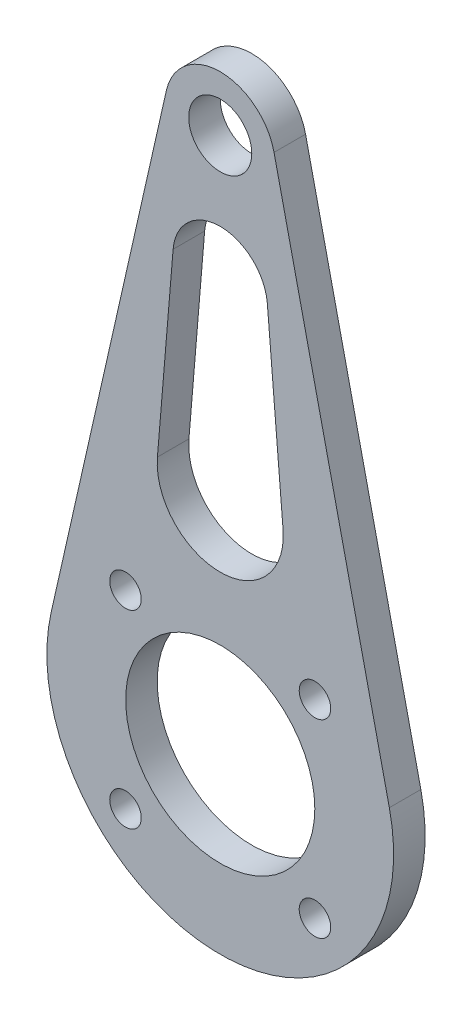
ISO-10303-21;
HEADER;
FILE_DESCRIPTION(('STEP AP214'),'2;1');
FILE_NAME('part.step','',(''),(''),'','','');
FILE_SCHEMA(('AUTOMOTIVE_DESIGN { 1 0 10303 214 1 1 1 1 }'));
ENDSEC;
DATA;
#1=APPLICATION_CONTEXT('core data for automotive mechanical design processes');
#2=APPLICATION_PROTOCOL_DEFINITION('international standard','automotive_design',2000,#1);
#3=PRODUCT_CONTEXT('',#1,'mechanical');
#4=PRODUCT('Part','Part','',(#3));
#5=PRODUCT_RELATED_PRODUCT_CATEGORY('part','',(#4));
#6=PRODUCT_DEFINITION_FORMATION('','',#4);
#7=PRODUCT_DEFINITION_CONTEXT('part definition',#1,'design');
#8=PRODUCT_DEFINITION('design','',#6,#7);
#9=PRODUCT_DEFINITION_SHAPE('','',#8);
#10=(LENGTH_UNIT() NAMED_UNIT(*) SI_UNIT(.MILLI.,.METRE.));
#11=(NAMED_UNIT(*) PLANE_ANGLE_UNIT() SI_UNIT($,.RADIAN.));
#12=(NAMED_UNIT(*) SI_UNIT($,.STERADIAN.) SOLID_ANGLE_UNIT());
#13=UNCERTAINTY_MEASURE_WITH_UNIT(LENGTH_MEASURE(1.E-05),#10,'distance_accuracy_value','');
#14=(GEOMETRIC_REPRESENTATION_CONTEXT(3) GLOBAL_UNCERTAINTY_ASSIGNED_CONTEXT((#13)) GLOBAL_UNIT_ASSIGNED_CONTEXT((#10,
#11,#12)) REPRESENTATION_CONTEXT('',''));
#15=CARTESIAN_POINT('',(0.,0.,0.));
#16=DIRECTION('',(0.,0.,1.));
#17=DIRECTION('',(1.,0.,0.));
#18=AXIS2_PLACEMENT_3D('',#15,#16,#17);
#19=CARTESIAN_POINT('',(0.,34.,2.));
#20=DIRECTION('',(0.,0.,1.));
#21=DIRECTION('',(1.,0.,0.));
#22=AXIS2_PLACEMENT_3D('',#19,#20,#21);
#23=PLANE('',#22);
#24=CARTESIAN_POINT('',(-6.01040764008559,-6.01040764008572,2.));
#25=DIRECTION('',(0.,0.,1.));
#26=DIRECTION('',(0.,-1.,0.));
#27=AXIS2_PLACEMENT_3D('',#24,#25,#26);
#28=CIRCLE('',#27,1.);
#29=CARTESIAN_POINT('',(-6.01040764008558,-7.01040764008572,2.));
#30=VERTEX_POINT('',#29);
#31=EDGE_CURVE('E257',#30,#30,#28,.T.);
#32=ORIENTED_EDGE('',*,*,#31,.F.);
#33=EDGE_LOOP('',(#32));
#34=FACE_BOUND('',#33,.T.);
#35=CARTESIAN_POINT('',(-6.01040764008566,6.01040764008565,2.));
#36=DIRECTION('',(0.,0.,1.));
#37=DIRECTION('',(-1.,0.,0.));
#38=AXIS2_PLACEMENT_3D('',#35,#36,#37);
#39=CIRCLE('',#38,1.);
#40=CARTESIAN_POINT('',(-7.01040764008566,6.01040764008565,2.));
#41=VERTEX_POINT('',#40);
#42=EDGE_CURVE('E265',#41,#41,#39,.T.);
#43=ORIENTED_EDGE('',*,*,#42,.F.);
#44=EDGE_LOOP('',(#43));
#45=FACE_BOUND('',#44,.T.);
#46=CARTESIAN_POINT('',(6.01040764008563,6.01040764008568,2.));
#47=DIRECTION('',(0.,0.,1.));
#48=DIRECTION('',(0.,1.,0.));
#49=AXIS2_PLACEMENT_3D('',#46,#47,#48);
#50=CIRCLE('',#49,1.);
#51=CARTESIAN_POINT('',(6.01040764008563,7.01040764008568,2.));
#52=VERTEX_POINT('',#51);
#53=EDGE_CURVE('E271',#52,#52,#50,.T.);
#54=ORIENTED_EDGE('',*,*,#53,.F.);
#55=EDGE_LOOP('',(#54));
#56=FACE_BOUND('',#55,.T.);
#57=CARTESIAN_POINT('',(6.01040764008566,-6.01040764008565,2.));
#58=DIRECTION('',(0.,0.,1.));
#59=DIRECTION('',(1.,0.,0.));
#60=AXIS2_PLACEMENT_3D('',#57,#58,#59);
#61=CIRCLE('',#60,1.);
#62=CARTESIAN_POINT('',(7.01040764008566,-6.01040764008565,2.));
#63=VERTEX_POINT('',#62);
#64=EDGE_CURVE('E277',#63,#63,#61,.T.);
#65=ORIENTED_EDGE('',*,*,#64,.F.);
#66=EDGE_LOOP('',(#65));
#67=FACE_BOUND('',#66,.T.);
#68=DIRECTION('',(-0.0833333333333333,0.996521728591783,0.));
#69=VECTOR('',#68,1.);
#70=CARTESIAN_POINT('',(2.98956518577535,26.25,2.));
#71=LINE('',#70,#69);
#72=CARTESIAN_POINT('',(3.98608691436713,14.3333333333333,2.));
#73=VERTEX_POINT('',#72);
#74=CARTESIAN_POINT('',(2.98956518577535,26.25,2.));
#75=VERTEX_POINT('',#74);
#76=EDGE_CURVE('E108',#73,#75,#71,.T.);
#77=ORIENTED_EDGE('',*,*,#76,.F.);
#78=CARTESIAN_POINT('',(0.,14.,2.));
#79=DIRECTION('',(0.,0.,1.));
#80=DIRECTION('',(1.,0.,0.));
#81=AXIS2_PLACEMENT_3D('',#78,#79,#80);
#82=CIRCLE('',#81,4.);
#83=CARTESIAN_POINT('',(-3.98608691436713,14.3333333333333,2.));
#84=VERTEX_POINT('',#83);
#85=EDGE_CURVE('E100',#84,#73,#82,.T.);
#86=ORIENTED_EDGE('',*,*,#85,.F.);
#87=DIRECTION('',(-0.0833333333333335,-0.996521728591783,0.));
#88=VECTOR('',#87,1.);
#89=CARTESIAN_POINT('',(-2.98956518577535,26.25,2.));
#90=LINE('',#89,#88);
#91=CARTESIAN_POINT('',(-2.98956518577535,26.25,2.));
#92=VERTEX_POINT('',#91);
#93=EDGE_CURVE('E123',#92,#84,#90,.T.);
#94=ORIENTED_EDGE('',*,*,#93,.F.);
#95=CARTESIAN_POINT('',(0.,26.,2.));
#96=DIRECTION('',(0.,0.,1.));
#97=DIRECTION('',(1.,0.,0.));
#98=AXIS2_PLACEMENT_3D('',#95,#96,#97);
#99=CIRCLE('',#98,3.);
#100=EDGE_CURVE('E121',#75,#92,#99,.T.);
#101=ORIENTED_EDGE('',*,*,#100,.F.);
#102=EDGE_LOOP('',(#77,#86,#94,#101));
#103=FACE_BOUND('',#102,.T.);
#104=CARTESIAN_POINT('',(0.,0.,2.));
#105=DIRECTION('',(0.,0.,1.));
#106=DIRECTION('',(1.,0.,0.));
#107=AXIS2_PLACEMENT_3D('',#104,#105,#106);
#108=CIRCLE('',#107,6.);
#109=CARTESIAN_POINT('',(6.,0.,2.));
#110=VERTEX_POINT('',#109);
#111=EDGE_CURVE('E139',#110,#110,#108,.T.);
#112=ORIENTED_EDGE('',*,*,#111,.F.);
#113=EDGE_LOOP('',(#112));
#114=FACE_BOUND('',#113,.T.);
#115=CARTESIAN_POINT('',(0.,34.,2.));
#116=DIRECTION('',(0.,0.,1.));
#117=DIRECTION('',(1.,0.,0.));
#118=AXIS2_PLACEMENT_3D('',#115,#116,#117);
#119=CIRCLE('',#118,3.5);
#120=CARTESIAN_POINT('',(3.41378458210391,34.7720588235294,2.));
#121=VERTEX_POINT('',#120);
#122=CARTESIAN_POINT('',(-3.41378458210391,34.7720588235294,2.));
#123=VERTEX_POINT('',#122);
#124=EDGE_CURVE('E145',#121,#123,#119,.T.);
#125=ORIENTED_EDGE('',*,*,#124,.T.);
#126=DIRECTION('',(-0.220588235294118,-0.975367023458261,0.));
#127=VECTOR('',#126,1.);
#128=CARTESIAN_POINT('',(-3.41378458210391,34.7720588235294,2.));
#129=LINE('',#128,#127);
#130=CARTESIAN_POINT('',(-10.7290372580409,2.42647058823529,2.));
#131=VERTEX_POINT('',#130);
#132=EDGE_CURVE('E148',#123,#131,#129,.T.);
#133=ORIENTED_EDGE('',*,*,#132,.T.);
#134=CARTESIAN_POINT('',(0.,0.,2.));
#135=DIRECTION('',(0.,0.,1.));
#136=DIRECTION('',(1.,0.,0.));
#137=AXIS2_PLACEMENT_3D('',#134,#135,#136);
#138=CIRCLE('',#137,11.);
#139=CARTESIAN_POINT('',(10.7290372580409,2.42647058823529,2.));
#140=VERTEX_POINT('',#139);
#141=EDGE_CURVE('E151',#131,#140,#138,.T.);
#142=ORIENTED_EDGE('',*,*,#141,.T.);
#143=DIRECTION('',(-0.220588235294117,0.975367023458261,0.));
#144=VECTOR('',#143,1.);
#145=CARTESIAN_POINT('',(3.41378458210391,34.7720588235294,2.));
#146=LINE('',#145,#144);
#147=EDGE_CURVE('E153',#140,#121,#146,.T.);
#148=ORIENTED_EDGE('',*,*,#147,.T.);
#149=EDGE_LOOP('',(#125,#133,#142,#148));
#150=FACE_BOUND('',#149,.T.);
#151=CARTESIAN_POINT('',(0.,34.,2.));
#152=DIRECTION('',(0.,0.,1.));
#153=DIRECTION('',(1.,0.,0.));
#154=AXIS2_PLACEMENT_3D('',#151,#152,#153);
#155=CIRCLE('',#154,2.);
#156=CARTESIAN_POINT('',(2.,34.,2.));
#157=VERTEX_POINT('',#156);
#158=EDGE_CURVE('E129',#157,#157,#155,.T.);
#159=ORIENTED_EDGE('',*,*,#158,.F.);
#160=EDGE_LOOP('',(#159));
#161=FACE_BOUND('',#160,.T.);
#162=ADVANCED_FACE('F35',(#34,#45,#56,#67,#103,#114,#150,#161),#23,.T.);
#163=CARTESIAN_POINT('',(0.,34.,0.));
#164=DIRECTION('',(0.,0.,1.));
#165=DIRECTION('',(1.,0.,0.));
#166=AXIS2_PLACEMENT_3D('',#163,#164,#165);
#167=PLANE('',#166);
#168=CARTESIAN_POINT('',(-6.01040764008559,-6.01040764008572,0.));
#169=DIRECTION('',(0.,0.,1.));
#170=DIRECTION('',(0.,-1.,0.));
#171=AXIS2_PLACEMENT_3D('',#168,#169,#170);
#172=CIRCLE('',#171,1.);
#173=CARTESIAN_POINT('',(-6.01040764008558,-7.01040764008572,0.));
#174=VERTEX_POINT('',#173);
#175=EDGE_CURVE('E260',#174,#174,#172,.T.);
#176=ORIENTED_EDGE('',*,*,#175,.T.);
#177=EDGE_LOOP('',(#176));
#178=FACE_BOUND('',#177,.T.);
#179=CARTESIAN_POINT('',(-6.01040764008566,6.01040764008565,0.));
#180=DIRECTION('',(0.,0.,1.));
#181=DIRECTION('',(-1.,0.,0.));
#182=AXIS2_PLACEMENT_3D('',#179,#180,#181);
#183=CIRCLE('',#182,1.);
#184=CARTESIAN_POINT('',(-7.01040764008566,6.01040764008565,0.));
#185=VERTEX_POINT('',#184);
#186=EDGE_CURVE('E262',#185,#185,#183,.T.);
#187=ORIENTED_EDGE('',*,*,#186,.T.);
#188=EDGE_LOOP('',(#187));
#189=FACE_BOUND('',#188,.T.);
#190=CARTESIAN_POINT('',(6.01040764008563,6.01040764008568,0.));
#191=DIRECTION('',(0.,0.,1.));
#192=DIRECTION('',(0.,1.,0.));
#193=AXIS2_PLACEMENT_3D('',#190,#191,#192);
#194=CIRCLE('',#193,1.);
#195=CARTESIAN_POINT('',(6.01040764008563,7.01040764008568,0.));
#196=VERTEX_POINT('',#195);
#197=EDGE_CURVE('E268',#196,#196,#194,.T.);
#198=ORIENTED_EDGE('',*,*,#197,.T.);
#199=EDGE_LOOP('',(#198));
#200=FACE_BOUND('',#199,.T.);
#201=CARTESIAN_POINT('',(6.01040764008566,-6.01040764008565,0.));
#202=DIRECTION('',(0.,0.,1.));
#203=DIRECTION('',(1.,0.,0.));
#204=AXIS2_PLACEMENT_3D('',#201,#202,#203);
#205=CIRCLE('',#204,1.);
#206=CARTESIAN_POINT('',(7.01040764008566,-6.01040764008565,0.));
#207=VERTEX_POINT('',#206);
#208=EDGE_CURVE('E274',#207,#207,#205,.T.);
#209=ORIENTED_EDGE('',*,*,#208,.T.);
#210=EDGE_LOOP('',(#209));
#211=FACE_BOUND('',#210,.T.);
#212=CARTESIAN_POINT('',(0.,0.,0.));
#213=DIRECTION('',(0.,0.,1.));
#214=DIRECTION('',(1.,0.,0.));
#215=AXIS2_PLACEMENT_3D('',#212,#213,#214);
#216=CIRCLE('',#215,6.);
#217=CARTESIAN_POINT('',(6.,0.,0.));
#218=VERTEX_POINT('',#217);
#219=EDGE_CURVE('E116',#218,#218,#216,.T.);
#220=ORIENTED_EDGE('',*,*,#219,.T.);
#221=EDGE_LOOP('',(#220));
#222=FACE_BOUND('',#221,.T.);
#223=CARTESIAN_POINT('',(0.,34.,0.));
#224=DIRECTION('',(0.,0.,1.));
#225=DIRECTION('',(1.,0.,0.));
#226=AXIS2_PLACEMENT_3D('',#223,#224,#225);
#227=CIRCLE('',#226,3.5);
#228=CARTESIAN_POINT('',(3.41378458210391,34.7720588235294,0.));
#229=VERTEX_POINT('',#228);
#230=CARTESIAN_POINT('',(-3.41378458210391,34.7720588235294,0.));
#231=VERTEX_POINT('',#230);
#232=EDGE_CURVE('E142',#229,#231,#227,.T.);
#233=ORIENTED_EDGE('',*,*,#232,.F.);
#234=DIRECTION('',(-0.220588235294117,0.975367023458261,0.));
#235=VECTOR('',#234,1.);
#236=CARTESIAN_POINT('',(3.41378458210391,34.7720588235294,0.));
#237=LINE('',#236,#235);
#238=CARTESIAN_POINT('',(10.7290372580409,2.42647058823529,0.));
#239=VERTEX_POINT('',#238);
#240=EDGE_CURVE('E149',#239,#229,#237,.T.);
#241=ORIENTED_EDGE('',*,*,#240,.F.);
#242=CARTESIAN_POINT('',(0.,0.,0.));
#243=DIRECTION('',(0.,0.,1.));
#244=DIRECTION('',(1.,0.,0.));
#245=AXIS2_PLACEMENT_3D('',#242,#243,#244);
#246=CIRCLE('',#245,11.);
#247=CARTESIAN_POINT('',(-10.7290372580409,2.42647058823529,0.));
#248=VERTEX_POINT('',#247);
#249=EDGE_CURVE('E160',#248,#239,#246,.T.);
#250=ORIENTED_EDGE('',*,*,#249,.F.);
#251=DIRECTION('',(-0.220588235294118,-0.975367023458261,0.));
#252=VECTOR('',#251,1.);
#253=CARTESIAN_POINT('',(-3.41378458210391,34.7720588235294,0.));
#254=LINE('',#253,#252);
#255=EDGE_CURVE('E158',#231,#248,#254,.T.);
#256=ORIENTED_EDGE('',*,*,#255,.F.);
#257=EDGE_LOOP('',(#233,#241,#250,#256));
#258=FACE_BOUND('',#257,.T.);
#259=CARTESIAN_POINT('',(0.,14.,0.));
#260=DIRECTION('',(0.,0.,1.));
#261=DIRECTION('',(1.,0.,0.));
#262=AXIS2_PLACEMENT_3D('',#259,#260,#261);
#263=CIRCLE('',#262,4.);
#264=CARTESIAN_POINT('',(-3.98608691436713,14.3333333333333,0.));
#265=VERTEX_POINT('',#264);
#266=CARTESIAN_POINT('',(3.98608691436713,14.3333333333333,0.));
#267=VERTEX_POINT('',#266);
#268=EDGE_CURVE('E58',#265,#267,#263,.T.);
#269=ORIENTED_EDGE('',*,*,#268,.T.);
#270=DIRECTION('',(-0.0833333333333333,0.996521728591783,0.));
#271=VECTOR('',#270,1.);
#272=CARTESIAN_POINT('',(2.98956518577535,26.25,0.));
#273=LINE('',#272,#271);
#274=CARTESIAN_POINT('',(2.98956518577535,26.25,0.));
#275=VERTEX_POINT('',#274);
#276=EDGE_CURVE('E115',#267,#275,#273,.T.);
#277=ORIENTED_EDGE('',*,*,#276,.T.);
#278=CARTESIAN_POINT('',(0.,26.,0.));
#279=DIRECTION('',(0.,0.,1.));
#280=DIRECTION('',(1.,0.,0.));
#281=AXIS2_PLACEMENT_3D('',#278,#279,#280);
#282=CIRCLE('',#281,3.);
#283=CARTESIAN_POINT('',(-2.98956518577535,26.25,0.));
#284=VERTEX_POINT('',#283);
#285=EDGE_CURVE('E131',#275,#284,#282,.T.);
#286=ORIENTED_EDGE('',*,*,#285,.T.);
#287=DIRECTION('',(-0.0833333333333335,-0.996521728591783,0.));
#288=VECTOR('',#287,1.);
#289=CARTESIAN_POINT('',(-2.98956518577535,26.25,0.));
#290=LINE('',#289,#288);
#291=EDGE_CURVE('E109',#284,#265,#290,.T.);
#292=ORIENTED_EDGE('',*,*,#291,.T.);
#293=EDGE_LOOP('',(#269,#277,#286,#292));
#294=FACE_BOUND('',#293,.T.);
#295=CARTESIAN_POINT('',(0.,34.,0.));
#296=DIRECTION('',(0.,0.,1.));
#297=DIRECTION('',(1.,0.,0.));
#298=AXIS2_PLACEMENT_3D('',#295,#296,#297);
#299=CIRCLE('',#298,2.);
#300=CARTESIAN_POINT('',(2.,34.,0.));
#301=VERTEX_POINT('',#300);
#302=EDGE_CURVE('E280',#301,#301,#299,.T.);
#303=ORIENTED_EDGE('',*,*,#302,.T.);
#304=EDGE_LOOP('',(#303));
#305=FACE_BOUND('',#304,.T.);
#306=ADVANCED_FACE('F178',(#178,#189,#200,#211,#222,#258,#294,#305),#167,.F.);
#307=CARTESIAN_POINT('',(0.,34.,2.));
#308=DIRECTION('',(0.,0.,-1.));
#309=DIRECTION('',(-1.,0.,0.));
#310=AXIS2_PLACEMENT_3D('',#307,#308,#309);
#311=CYLINDRICAL_SURFACE('',#310,3.5);
#312=ORIENTED_EDGE('',*,*,#232,.T.);
#313=DIRECTION('',(0.,0.,-1.));
#314=VECTOR('',#313,1.);
#315=CARTESIAN_POINT('',(-3.41378458210391,34.7720588235294,2.));
#316=LINE('',#315,#314);
#317=EDGE_CURVE('E11',#123,#231,#316,.T.);
#318=ORIENTED_EDGE('',*,*,#317,.F.);
#319=ORIENTED_EDGE('',*,*,#124,.F.);
#320=DIRECTION('',(0.,0.,-1.));
#321=VECTOR('',#320,1.);
#322=CARTESIAN_POINT('',(3.41378458210391,34.7720588235294,2.));
#323=LINE('',#322,#321);
#324=EDGE_CURVE('E155',#121,#229,#323,.T.);
#325=ORIENTED_EDGE('',*,*,#324,.T.);
#326=EDGE_LOOP('',(#312,#318,#319,#325));
#327=FACE_BOUND('',#326,.T.);
#328=ADVANCED_FACE('F37',(#327),#311,.T.);
#329=CARTESIAN_POINT('',(-3.41378458210391,34.7720588235294,2.));
#330=DIRECTION('',(0.975367023458261,-0.220588235294118,0.));
#331=DIRECTION('',(0.220588235294118,0.975367023458261,0.));
#332=AXIS2_PLACEMENT_3D('',#329,#330,#331);
#333=PLANE('',#332);
#334=ORIENTED_EDGE('',*,*,#255,.T.);
#335=DIRECTION('',(0.,0.,-1.));
#336=VECTOR('',#335,1.);
#337=CARTESIAN_POINT('',(-10.7290372580409,2.42647058823529,2.));
#338=LINE('',#337,#336);
#339=EDGE_CURVE('E43',#131,#248,#338,.T.);
#340=ORIENTED_EDGE('',*,*,#339,.F.);
#341=ORIENTED_EDGE('',*,*,#132,.F.);
#342=ORIENTED_EDGE('',*,*,#317,.T.);
#343=EDGE_LOOP('',(#334,#340,#341,#342));
#344=FACE_BOUND('',#343,.T.);
#345=ADVANCED_FACE('F189',(#344),#333,.F.);
#346=CARTESIAN_POINT('',(0.,0.,2.));
#347=DIRECTION('',(0.,0.,-1.));
#348=DIRECTION('',(-1.,0.,0.));
#349=AXIS2_PLACEMENT_3D('',#346,#347,#348);
#350=CYLINDRICAL_SURFACE('',#349,11.);
#351=ORIENTED_EDGE('',*,*,#249,.T.);
#352=DIRECTION('',(0.,0.,-1.));
#353=VECTOR('',#352,1.);
#354=CARTESIAN_POINT('',(10.7290372580409,2.42647058823529,2.));
#355=LINE('',#354,#353);
#356=EDGE_CURVE('E165',#140,#239,#355,.T.);
#357=ORIENTED_EDGE('',*,*,#356,.F.);
#358=ORIENTED_EDGE('',*,*,#141,.F.);
#359=ORIENTED_EDGE('',*,*,#339,.T.);
#360=EDGE_LOOP('',(#351,#357,#358,#359));
#361=FACE_BOUND('',#360,.T.);
#362=ADVANCED_FACE('F172',(#361),#350,.T.);
#363=CARTESIAN_POINT('',(3.41378458210391,34.7720588235294,2.));
#364=DIRECTION('',(-0.975367023458261,-0.220588235294117,0.));
#365=DIRECTION('',(0.220588235294117,-0.975367023458261,0.));
#366=AXIS2_PLACEMENT_3D('',#363,#364,#365);
#367=PLANE('',#366);
#368=ORIENTED_EDGE('',*,*,#240,.T.);
#369=ORIENTED_EDGE('',*,*,#324,.F.);
#370=ORIENTED_EDGE('',*,*,#147,.F.);
#371=ORIENTED_EDGE('',*,*,#356,.T.);
#372=EDGE_LOOP('',(#368,#369,#370,#371));
#373=FACE_BOUND('',#372,.T.);
#374=ADVANCED_FACE('F182',(#373),#367,.F.);
#375=CARTESIAN_POINT('',(0.,0.,2.));
#376=DIRECTION('',(0.,0.,-1.));
#377=DIRECTION('',(-1.,0.,0.));
#378=AXIS2_PLACEMENT_3D('',#375,#376,#377);
#379=CYLINDRICAL_SURFACE('',#378,6.);
#380=ORIENTED_EDGE('',*,*,#111,.T.);
#381=EDGE_LOOP('',(#380));
#382=FACE_BOUND('',#381,.T.);
#383=ORIENTED_EDGE('',*,*,#219,.F.);
#384=EDGE_LOOP('',(#383));
#385=FACE_BOUND('',#384,.T.);
#386=ADVANCED_FACE('F207',(#382,#385),#379,.F.);
#387=CARTESIAN_POINT('',(0.,14.,2.));
#388=DIRECTION('',(0.,0.,-1.));
#389=DIRECTION('',(-1.,0.,0.));
#390=AXIS2_PLACEMENT_3D('',#387,#388,#389);
#391=CYLINDRICAL_SURFACE('',#390,4.);
#392=ORIENTED_EDGE('',*,*,#268,.F.);
#393=DIRECTION('',(0.,0.,-1.));
#394=VECTOR('',#393,1.);
#395=CARTESIAN_POINT('',(-3.98608691436713,14.3333333333333,2.));
#396=LINE('',#395,#394);
#397=EDGE_CURVE('E104',#84,#265,#396,.T.);
#398=ORIENTED_EDGE('',*,*,#397,.F.);
#399=ORIENTED_EDGE('',*,*,#85,.T.);
#400=DIRECTION('',(0.,0.,-1.));
#401=VECTOR('',#400,1.);
#402=CARTESIAN_POINT('',(3.98608691436713,14.3333333333333,2.));
#403=LINE('',#402,#401);
#404=EDGE_CURVE('E103',#73,#267,#403,.T.);
#405=ORIENTED_EDGE('',*,*,#404,.T.);
#406=EDGE_LOOP('',(#392,#398,#399,#405));
#407=FACE_BOUND('',#406,.T.);
#408=ADVANCED_FACE('F102',(#407),#391,.F.);
#409=CARTESIAN_POINT('',(2.98956518577535,26.25,2.));
#410=DIRECTION('',(-0.996521728591783,-0.0833333333333333,0.));
#411=DIRECTION('',(0.0833333333333333,-0.996521728591783,0.));
#412=AXIS2_PLACEMENT_3D('',#409,#410,#411);
#413=PLANE('',#412);
#414=ORIENTED_EDGE('',*,*,#276,.F.);
#415=ORIENTED_EDGE('',*,*,#404,.F.);
#416=ORIENTED_EDGE('',*,*,#76,.T.);
#417=DIRECTION('',(0.,0.,-1.));
#418=VECTOR('',#417,1.);
#419=CARTESIAN_POINT('',(2.98956518577535,26.25,2.));
#420=LINE('',#419,#418);
#421=EDGE_CURVE('E117',#75,#275,#420,.T.);
#422=ORIENTED_EDGE('',*,*,#421,.T.);
#423=EDGE_LOOP('',(#414,#415,#416,#422));
#424=FACE_BOUND('',#423,.T.);
#425=ADVANCED_FACE('F112',(#424),#413,.T.);
#426=CARTESIAN_POINT('',(0.,26.,2.));
#427=DIRECTION('',(0.,0.,-1.));
#428=DIRECTION('',(-1.,0.,0.));
#429=AXIS2_PLACEMENT_3D('',#426,#427,#428);
#430=CYLINDRICAL_SURFACE('',#429,3.);
#431=ORIENTED_EDGE('',*,*,#285,.F.);
#432=ORIENTED_EDGE('',*,*,#421,.F.);
#433=ORIENTED_EDGE('',*,*,#100,.T.);
#434=DIRECTION('',(0.,0.,-1.));
#435=VECTOR('',#434,1.);
#436=CARTESIAN_POINT('',(-2.98956518577535,26.25,2.));
#437=LINE('',#436,#435);
#438=EDGE_CURVE('E50',#92,#284,#437,.T.);
#439=ORIENTED_EDGE('',*,*,#438,.T.);
#440=EDGE_LOOP('',(#431,#432,#433,#439));
#441=FACE_BOUND('',#440,.T.);
#442=ADVANCED_FACE('F225',(#441),#430,.F.);
#443=CARTESIAN_POINT('',(-2.98956518577535,26.25,2.));
#444=DIRECTION('',(0.996521728591783,-0.0833333333333335,0.));
#445=DIRECTION('',(0.0833333333333335,0.996521728591783,0.));
#446=AXIS2_PLACEMENT_3D('',#443,#444,#445);
#447=PLANE('',#446);
#448=ORIENTED_EDGE('',*,*,#291,.F.);
#449=ORIENTED_EDGE('',*,*,#438,.F.);
#450=ORIENTED_EDGE('',*,*,#93,.T.);
#451=ORIENTED_EDGE('',*,*,#397,.T.);
#452=EDGE_LOOP('',(#448,#449,#450,#451));
#453=FACE_BOUND('',#452,.T.);
#454=ADVANCED_FACE('F230',(#453),#447,.T.);
#455=CARTESIAN_POINT('',(0.,34.,2.));
#456=DIRECTION('',(0.,0.,-1.));
#457=DIRECTION('',(-1.,0.,0.));
#458=AXIS2_PLACEMENT_3D('',#455,#456,#457);
#459=CYLINDRICAL_SURFACE('',#458,2.);
#460=ORIENTED_EDGE('',*,*,#158,.T.);
#461=EDGE_LOOP('',(#460));
#462=FACE_BOUND('',#461,.T.);
#463=ORIENTED_EDGE('',*,*,#302,.F.);
#464=EDGE_LOOP('',(#463));
#465=FACE_BOUND('',#464,.T.);
#466=ADVANCED_FACE('F234',(#462,#465),#459,.F.);
#467=CARTESIAN_POINT('',(6.01040764008566,-6.01040764008565,2.));
#468=DIRECTION('',(0.,0.,-1.));
#469=DIRECTION('',(-1.,0.,0.));
#470=AXIS2_PLACEMENT_3D('',#467,#468,#469);
#471=CYLINDRICAL_SURFACE('',#470,1.);
#472=ORIENTED_EDGE('',*,*,#64,.T.);
#473=EDGE_LOOP('',(#472));
#474=FACE_BOUND('',#473,.T.);
#475=ORIENTED_EDGE('',*,*,#208,.F.);
#476=EDGE_LOOP('',(#475));
#477=FACE_BOUND('',#476,.T.);
#478=ADVANCED_FACE('F237',(#474,#477),#471,.F.);
#479=CARTESIAN_POINT('',(6.01040764008563,6.01040764008568,2.));
#480=DIRECTION('',(0.,0.,-1.));
#481=DIRECTION('',(-1.,0.,0.));
#482=AXIS2_PLACEMENT_3D('',#479,#480,#481);
#483=CYLINDRICAL_SURFACE('',#482,1.);
#484=ORIENTED_EDGE('',*,*,#53,.T.);
#485=EDGE_LOOP('',(#484));
#486=FACE_BOUND('',#485,.T.);
#487=ORIENTED_EDGE('',*,*,#197,.F.);
#488=EDGE_LOOP('',(#487));
#489=FACE_BOUND('',#488,.T.);
#490=ADVANCED_FACE('F241',(#486,#489),#483,.F.);
#491=CARTESIAN_POINT('',(-6.01040764008566,6.01040764008565,2.));
#492=DIRECTION('',(0.,0.,-1.));
#493=DIRECTION('',(-1.,0.,0.));
#494=AXIS2_PLACEMENT_3D('',#491,#492,#493);
#495=CYLINDRICAL_SURFACE('',#494,1.);
#496=ORIENTED_EDGE('',*,*,#42,.T.);
#497=EDGE_LOOP('',(#496));
#498=FACE_BOUND('',#497,.T.);
#499=ORIENTED_EDGE('',*,*,#186,.F.);
#500=EDGE_LOOP('',(#499));
#501=FACE_BOUND('',#500,.T.);
#502=ADVANCED_FACE('F245',(#498,#501),#495,.F.);
#503=CARTESIAN_POINT('',(-6.01040764008559,-6.01040764008572,2.));
#504=DIRECTION('',(0.,0.,-1.));
#505=DIRECTION('',(-1.,0.,0.));
#506=AXIS2_PLACEMENT_3D('',#503,#504,#505);
#507=CYLINDRICAL_SURFACE('',#506,1.);
#508=ORIENTED_EDGE('',*,*,#31,.T.);
#509=EDGE_LOOP('',(#508));
#510=FACE_BOUND('',#509,.T.);
#511=ORIENTED_EDGE('',*,*,#175,.F.);
#512=EDGE_LOOP('',(#511));
#513=FACE_BOUND('',#512,.T.);
#514=ADVANCED_FACE('F249',(#510,#513),#507,.F.);
#515=CLOSED_SHELL('',(#162,#306,#328,#345,#362,#374,#386,#408,#425,#442,#454,#466,#478,#490,
#502,#514));
#516=MANIFOLD_SOLID_BREP('B2',#515);
#517=ADVANCED_BREP_SHAPE_REPRESENTATION('',(#18,#516),#14);
#518=SHAPE_DEFINITION_REPRESENTATION(#9,#517);
ENDSEC;
END-ISO-10303-21;
